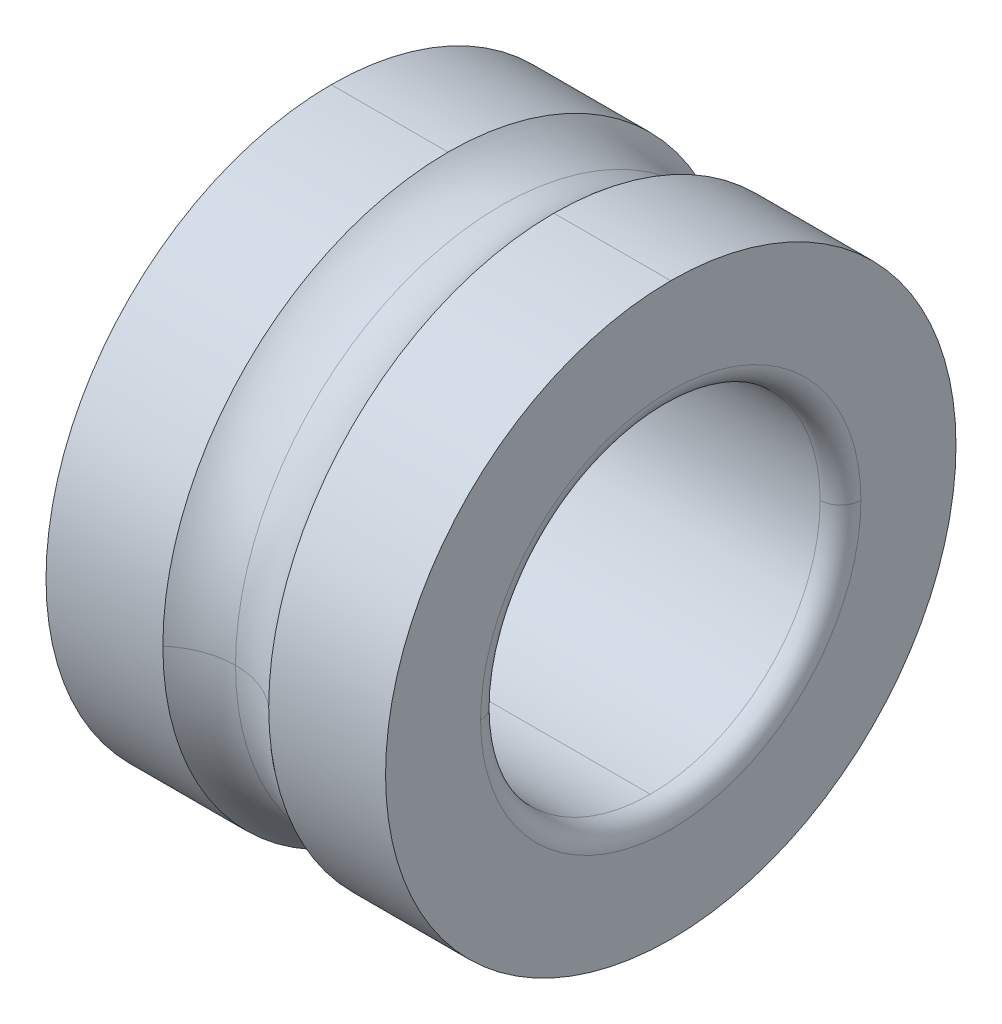
ISO-10303-21;
HEADER;
FILE_DESCRIPTION(('STEP AP214'),'2;1');
FILE_NAME('part.step','',(''),(''),'','','');
FILE_SCHEMA(('AUTOMOTIVE_DESIGN { 1 0 10303 214 1 1 1 1 }'));
ENDSEC;
DATA;
#1=APPLICATION_CONTEXT('core data for automotive mechanical design processes');
#2=APPLICATION_PROTOCOL_DEFINITION('international standard','automotive_design',2000,#1);
#3=PRODUCT_CONTEXT('',#1,'mechanical');
#4=PRODUCT('Part','Part','',(#3));
#5=PRODUCT_RELATED_PRODUCT_CATEGORY('part','',(#4));
#6=PRODUCT_DEFINITION_FORMATION('','',#4);
#7=PRODUCT_DEFINITION_CONTEXT('part definition',#1,'design');
#8=PRODUCT_DEFINITION('design','',#6,#7);
#9=PRODUCT_DEFINITION_SHAPE('','',#8);
#10=(LENGTH_UNIT() NAMED_UNIT(*) SI_UNIT(.MILLI.,.METRE.));
#11=(NAMED_UNIT(*) PLANE_ANGLE_UNIT() SI_UNIT($,.RADIAN.));
#12=(NAMED_UNIT(*) SI_UNIT($,.STERADIAN.) SOLID_ANGLE_UNIT());
#13=UNCERTAINTY_MEASURE_WITH_UNIT(LENGTH_MEASURE(1.E-05),#10,'distance_accuracy_value','');
#14=(GEOMETRIC_REPRESENTATION_CONTEXT(3) GLOBAL_UNCERTAINTY_ASSIGNED_CONTEXT((#13)) GLOBAL_UNIT_ASSIGNED_CONTEXT((#10,
#11,#12)) REPRESENTATION_CONTEXT('',''));
#15=CARTESIAN_POINT('',(0.,0.,0.));
#16=DIRECTION('',(0.,0.,1.));
#17=DIRECTION('',(1.,0.,0.));
#18=AXIS2_PLACEMENT_3D('',#15,#16,#17);
#19=CARTESIAN_POINT('',(4.13964414855096,0.,0.));
#20=DIRECTION('',(1.,0.,0.));
#21=DIRECTION('',(0.,1.,0.));
#22=AXIS2_PLACEMENT_3D('',#19,#20,#21);
#23=CYLINDRICAL_SURFACE('',#22,4.2);
#24=DIRECTION('',(1.,0.,0.));
#25=VECTOR('',#24,1.);
#26=CARTESIAN_POINT('',(4.13964414855096,4.2,0.));
#27=LINE('',#26,#25);
#28=CARTESIAN_POINT('',(3.27928829710191,4.2,0.));
#29=VERTEX_POINT('',#28);
#30=CARTESIAN_POINT('',(5.,4.2,0.));
#31=VERTEX_POINT('',#30);
#32=EDGE_CURVE('E183',#29,#31,#27,.T.);
#33=ORIENTED_EDGE('',*,*,#32,.T.);
#34=CARTESIAN_POINT('',(5.,0.,0.));
#35=DIRECTION('',(1.,0.,0.));
#36=DIRECTION('',(0.,1.,0.));
#37=AXIS2_PLACEMENT_3D('',#34,#35,#36);
#38=CIRCLE('',#37,4.2);
#39=CARTESIAN_POINT('',(5.,-4.2,0.));
#40=VERTEX_POINT('',#39);
#41=EDGE_CURVE('E137',#40,#31,#38,.T.);
#42=ORIENTED_EDGE('',*,*,#41,.F.);
#43=DIRECTION('',(-1.,0.,0.));
#44=VECTOR('',#43,1.);
#45=CARTESIAN_POINT('',(4.13964414855096,-4.2,0.));
#46=LINE('',#45,#44);
#47=CARTESIAN_POINT('',(3.27928829710191,-4.2,0.));
#48=VERTEX_POINT('',#47);
#49=EDGE_CURVE('E191',#40,#48,#46,.T.);
#50=ORIENTED_EDGE('',*,*,#49,.T.);
#51=CARTESIAN_POINT('',(3.27928829710191,0.,0.));
#52=DIRECTION('',(1.,0.,0.));
#53=DIRECTION('',(0.,1.,0.));
#54=AXIS2_PLACEMENT_3D('',#51,#52,#53);
#55=CIRCLE('',#54,4.2);
#56=CARTESIAN_POINT('',(3.27928829710191,0.,-4.2));
#57=VERTEX_POINT('',#56);
#58=EDGE_CURVE('E174',#48,#57,#55,.T.);
#59=ORIENTED_EDGE('',*,*,#58,.T.);
#60=CARTESIAN_POINT('',(3.27928829710191,0.,0.));
#61=DIRECTION('',(1.,0.,0.));
#62=DIRECTION('',(0.,1.,0.));
#63=AXIS2_PLACEMENT_3D('',#60,#61,#62);
#64=CIRCLE('',#63,4.2);
#65=EDGE_CURVE('E180',#57,#29,#64,.T.);
#66=ORIENTED_EDGE('',*,*,#65,.T.);
#67=EDGE_LOOP('',(#33,#42,#50,#59,#66));
#68=FACE_BOUND('',#67,.T.);
#69=ADVANCED_FACE('F16',(#68),#23,.T.);
#70=CARTESIAN_POINT('',(2.5,0.,0.));
#71=DIRECTION('',(1.,0.,0.));
#72=DIRECTION('',(0.,0.,-1.));
#73=AXIS2_PLACEMENT_3D('',#70,#71,#72);
#74=TOROIDAL_SURFACE('',#73,5.1,1.1905);
#75=CARTESIAN_POINT('',(2.5,0.,0.));
#76=DIRECTION('',(-1.,0.,0.));
#77=DIRECTION('',(0.,0.,1.));
#78=AXIS2_PLACEMENT_3D('',#75,#76,#77);
#79=CIRCLE('',#78,3.9095);
#80=CARTESIAN_POINT('',(2.5,0.,3.9095));
#81=VERTEX_POINT('',#80);
#82=CARTESIAN_POINT('',(2.5,0.,-3.9095));
#83=VERTEX_POINT('',#82);
#84=EDGE_CURVE('E167',#81,#83,#79,.T.);
#85=ORIENTED_EDGE('',*,*,#84,.T.);
#86=CARTESIAN_POINT('',(2.5,0.,-5.1));
#87=DIRECTION('',(0.,-1.,0.));
#88=DIRECTION('',(0.,0.,-1.));
#89=AXIS2_PLACEMENT_3D('',#86,#87,#88);
#90=CIRCLE('',#89,1.1905);
#91=CARTESIAN_POINT('',(1.72071170289809,0.,-4.2));
#92=VERTEX_POINT('',#91);
#93=EDGE_CURVE('E160',#83,#92,#90,.T.);
#94=ORIENTED_EDGE('',*,*,#93,.T.);
#95=CARTESIAN_POINT('',(1.72071170289809,0.,0.));
#96=DIRECTION('',(1.,0.,0.));
#97=DIRECTION('',(0.,1.,0.));
#98=AXIS2_PLACEMENT_3D('',#95,#96,#97);
#99=CIRCLE('',#98,4.2);
#100=CARTESIAN_POINT('',(1.72071170289809,4.2,0.));
#101=VERTEX_POINT('',#100);
#102=EDGE_CURVE('E11',#92,#101,#99,.T.);
#103=ORIENTED_EDGE('',*,*,#102,.T.);
#104=CARTESIAN_POINT('',(1.72071170289809,0.,0.));
#105=DIRECTION('',(1.,0.,0.));
#106=DIRECTION('',(0.,1.,0.));
#107=AXIS2_PLACEMENT_3D('',#104,#105,#106);
#108=CIRCLE('',#107,4.2);
#109=CARTESIAN_POINT('',(1.72071170289809,0.,4.2));
#110=VERTEX_POINT('',#109);
#111=EDGE_CURVE('E159',#101,#110,#108,.T.);
#112=ORIENTED_EDGE('',*,*,#111,.T.);
#113=CARTESIAN_POINT('',(2.5,0.,5.1));
#114=DIRECTION('',(0.,-1.,0.));
#115=DIRECTION('',(0.,0.,1.));
#116=AXIS2_PLACEMENT_3D('',#113,#114,#115);
#117=CIRCLE('',#116,1.1905);
#118=EDGE_CURVE('E201',#110,#81,#117,.T.);
#119=ORIENTED_EDGE('',*,*,#118,.T.);
#120=EDGE_LOOP('',(#85,#94,#103,#112,#119));
#121=FACE_BOUND('',#120,.T.);
#122=ADVANCED_FACE('F259',(#121),#74,.F.);
#123=CARTESIAN_POINT('',(0.860355851449043,0.,0.));
#124=DIRECTION('',(1.,0.,0.));
#125=DIRECTION('',(0.,1.,0.));
#126=AXIS2_PLACEMENT_3D('',#123,#124,#125);
#127=CYLINDRICAL_SURFACE('',#126,4.2);
#128=DIRECTION('',(1.,0.,0.));
#129=VECTOR('',#128,1.);
#130=CARTESIAN_POINT('',(0.860355851449043,4.2,0.));
#131=LINE('',#130,#129);
#132=CARTESIAN_POINT('',(0.,4.2,0.));
#133=VERTEX_POINT('',#132);
#134=EDGE_CURVE('E148',#133,#101,#131,.T.);
#135=ORIENTED_EDGE('',*,*,#134,.T.);
#136=ORIENTED_EDGE('',*,*,#102,.F.);
#137=CARTESIAN_POINT('',(1.72071170289809,0.,0.));
#138=DIRECTION('',(1.,0.,0.));
#139=DIRECTION('',(0.,1.,0.));
#140=AXIS2_PLACEMENT_3D('',#137,#138,#139);
#141=CIRCLE('',#140,4.2);
#142=CARTESIAN_POINT('',(1.72071170289809,-4.2,0.));
#143=VERTEX_POINT('',#142);
#144=EDGE_CURVE('E163',#143,#92,#141,.T.);
#145=ORIENTED_EDGE('',*,*,#144,.F.);
#146=DIRECTION('',(-1.,0.,0.));
#147=VECTOR('',#146,1.);
#148=CARTESIAN_POINT('',(0.860355851449043,-4.2,0.));
#149=LINE('',#148,#147);
#150=CARTESIAN_POINT('',(0.,-4.2,0.));
#151=VERTEX_POINT('',#150);
#152=EDGE_CURVE('E150',#143,#151,#149,.T.);
#153=ORIENTED_EDGE('',*,*,#152,.T.);
#154=CARTESIAN_POINT('',(0.,0.,0.));
#155=DIRECTION('',(1.,0.,0.));
#156=DIRECTION('',(0.,1.,0.));
#157=AXIS2_PLACEMENT_3D('',#154,#155,#156);
#158=CIRCLE('',#157,4.2);
#159=EDGE_CURVE('E24',#151,#133,#158,.T.);
#160=ORIENTED_EDGE('',*,*,#159,.T.);
#161=EDGE_LOOP('',(#135,#136,#145,#153,#160));
#162=FACE_BOUND('',#161,.T.);
#163=ADVANCED_FACE('F146',(#162),#127,.T.);
#164=CARTESIAN_POINT('',(0.,3.5,0.));
#165=DIRECTION('',(-1.,0.,0.));
#166=DIRECTION('',(0.,0.,1.));
#167=AXIS2_PLACEMENT_3D('',#164,#165,#166);
#168=PLANE('',#167);
#169=CARTESIAN_POINT('',(0.,0.,0.));
#170=DIRECTION('',(1.,0.,0.));
#171=DIRECTION('',(0.,1.,0.));
#172=AXIS2_PLACEMENT_3D('',#169,#170,#171);
#173=CIRCLE('',#172,2.8);
#174=CARTESIAN_POINT('',(0.,0.,2.8));
#175=VERTEX_POINT('',#174);
#176=CARTESIAN_POINT('',(0.,0.,-2.8));
#177=VERTEX_POINT('',#176);
#178=EDGE_CURVE('E140',#175,#177,#173,.T.);
#179=ORIENTED_EDGE('',*,*,#178,.T.);
#180=CARTESIAN_POINT('',(0.,0.,0.));
#181=DIRECTION('',(1.,0.,0.));
#182=DIRECTION('',(0.,1.,0.));
#183=AXIS2_PLACEMENT_3D('',#180,#181,#182);
#184=CIRCLE('',#183,2.8);
#185=EDGE_CURVE('E222',#177,#175,#184,.T.);
#186=ORIENTED_EDGE('',*,*,#185,.T.);
#187=EDGE_LOOP('',(#179,#186));
#188=FACE_BOUND('',#187,.T.);
#189=CARTESIAN_POINT('',(0.,0.,0.));
#190=DIRECTION('',(1.,0.,0.));
#191=DIRECTION('',(0.,1.,0.));
#192=AXIS2_PLACEMENT_3D('',#189,#190,#191);
#193=CIRCLE('',#192,4.2);
#194=EDGE_CURVE('E153',#133,#151,#193,.T.);
#195=ORIENTED_EDGE('',*,*,#194,.F.);
#196=ORIENTED_EDGE('',*,*,#159,.F.);
#197=EDGE_LOOP('',(#195,#196));
#198=FACE_BOUND('',#197,.T.);
#199=ADVANCED_FACE('F18',(#188,#198),#168,.T.);
#200=CARTESIAN_POINT('',(0.3,0.,0.));
#201=DIRECTION('',(1.,0.,0.));
#202=DIRECTION('',(0.,0.,-1.));
#203=AXIS2_PLACEMENT_3D('',#200,#201,#202);
#204=TOROIDAL_SURFACE('',#203,2.8,0.3);
#205=CARTESIAN_POINT('',(0.3,0.,-2.8));
#206=DIRECTION('',(0.,-1.,0.));
#207=DIRECTION('',(0.,0.,-1.));
#208=AXIS2_PLACEMENT_3D('',#205,#206,#207);
#209=CIRCLE('',#208,0.3);
#210=CARTESIAN_POINT('',(0.3,0.,-2.5));
#211=VERTEX_POINT('',#210);
#212=EDGE_CURVE('E210',#211,#177,#209,.T.);
#213=ORIENTED_EDGE('',*,*,#212,.T.);
#214=ORIENTED_EDGE('',*,*,#178,.F.);
#215=CARTESIAN_POINT('',(0.3,0.,2.8));
#216=DIRECTION('',(0.,-1.,0.));
#217=DIRECTION('',(0.,0.,1.));
#218=AXIS2_PLACEMENT_3D('',#215,#216,#217);
#219=CIRCLE('',#218,0.3);
#220=CARTESIAN_POINT('',(0.3,0.,2.5));
#221=VERTEX_POINT('',#220);
#222=EDGE_CURVE('E219',#175,#221,#219,.T.);
#223=ORIENTED_EDGE('',*,*,#222,.T.);
#224=CARTESIAN_POINT('',(0.3,0.,0.));
#225=DIRECTION('',(1.,0.,0.));
#226=DIRECTION('',(0.,1.,0.));
#227=AXIS2_PLACEMENT_3D('',#224,#225,#226);
#228=CIRCLE('',#227,2.5);
#229=CARTESIAN_POINT('',(0.3,-2.5,0.));
#230=VERTEX_POINT('',#229);
#231=EDGE_CURVE('E138',#221,#230,#228,.T.);
#232=ORIENTED_EDGE('',*,*,#231,.T.);
#233=CARTESIAN_POINT('',(0.3,0.,0.));
#234=DIRECTION('',(1.,0.,0.));
#235=DIRECTION('',(0.,1.,0.));
#236=AXIS2_PLACEMENT_3D('',#233,#234,#235);
#237=CIRCLE('',#236,2.5);
#238=EDGE_CURVE('E130',#230,#211,#237,.T.);
#239=ORIENTED_EDGE('',*,*,#238,.T.);
#240=EDGE_LOOP('',(#213,#214,#223,#232,#239));
#241=FACE_BOUND('',#240,.T.);
#242=ADVANCED_FACE('F228',(#241),#204,.T.);
#243=CARTESIAN_POINT('',(2.5,0.,0.));
#244=DIRECTION('',(1.,0.,0.));
#245=DIRECTION('',(0.,1.,0.));
#246=AXIS2_PLACEMENT_3D('',#243,#244,#245);
#247=CYLINDRICAL_SURFACE('',#246,2.5);
#248=DIRECTION('',(1.,0.,0.));
#249=VECTOR('',#248,1.);
#250=CARTESIAN_POINT('',(2.5,2.5,0.));
#251=LINE('',#250,#249);
#252=CARTESIAN_POINT('',(0.3,2.5,0.));
#253=VERTEX_POINT('',#252);
#254=CARTESIAN_POINT('',(4.7,2.5,0.));
#255=VERTEX_POINT('',#254);
#256=EDGE_CURVE('E225',#253,#255,#251,.T.);
#257=ORIENTED_EDGE('',*,*,#256,.T.);
#258=CARTESIAN_POINT('',(4.7,0.,0.));
#259=DIRECTION('',(1.,0.,0.));
#260=DIRECTION('',(0.,1.,0.));
#261=AXIS2_PLACEMENT_3D('',#258,#259,#260);
#262=CIRCLE('',#261,2.5);
#263=CARTESIAN_POINT('',(4.7,0.,2.5));
#264=VERTEX_POINT('',#263);
#265=EDGE_CURVE('E121',#255,#264,#262,.T.);
#266=ORIENTED_EDGE('',*,*,#265,.T.);
#267=CARTESIAN_POINT('',(4.7,0.,0.));
#268=DIRECTION('',(1.,0.,0.));
#269=DIRECTION('',(0.,1.,0.));
#270=AXIS2_PLACEMENT_3D('',#267,#268,#269);
#271=CIRCLE('',#270,2.5);
#272=CARTESIAN_POINT('',(4.7,-2.5,0.));
#273=VERTEX_POINT('',#272);
#274=EDGE_CURVE('E31',#264,#273,#271,.T.);
#275=ORIENTED_EDGE('',*,*,#274,.T.);
#276=DIRECTION('',(-1.,0.,0.));
#277=VECTOR('',#276,1.);
#278=CARTESIAN_POINT('',(2.5,-2.5,0.));
#279=LINE('',#278,#277);
#280=EDGE_CURVE('E128',#273,#230,#279,.T.);
#281=ORIENTED_EDGE('',*,*,#280,.T.);
#282=ORIENTED_EDGE('',*,*,#231,.F.);
#283=CARTESIAN_POINT('',(0.3,0.,0.));
#284=DIRECTION('',(1.,0.,0.));
#285=DIRECTION('',(0.,1.,0.));
#286=AXIS2_PLACEMENT_3D('',#283,#284,#285);
#287=CIRCLE('',#286,2.5);
#288=EDGE_CURVE('E216',#253,#221,#287,.T.);
#289=ORIENTED_EDGE('',*,*,#288,.F.);
#290=EDGE_LOOP('',(#257,#266,#275,#281,#282,#289));
#291=FACE_BOUND('',#290,.T.);
#292=ADVANCED_FACE('F237',(#291),#247,.F.);
#293=CARTESIAN_POINT('',(4.7,0.,0.));
#294=DIRECTION('',(1.,0.,0.));
#295=DIRECTION('',(0.,0.,-1.));
#296=AXIS2_PLACEMENT_3D('',#293,#294,#295);
#297=TOROIDAL_SURFACE('',#296,2.8,0.3);
#298=CARTESIAN_POINT('',(4.7,0.,-2.8));
#299=DIRECTION('',(0.,-1.,0.));
#300=DIRECTION('',(0.,0.,-1.));
#301=AXIS2_PLACEMENT_3D('',#298,#299,#300);
#302=CIRCLE('',#301,0.3);
#303=CARTESIAN_POINT('',(5.,0.,-2.8));
#304=VERTEX_POINT('',#303);
#305=CARTESIAN_POINT('',(4.7,0.,-2.5));
#306=VERTEX_POINT('',#305);
#307=EDGE_CURVE('E107',#304,#306,#302,.T.);
#308=ORIENTED_EDGE('',*,*,#307,.T.);
#309=CARTESIAN_POINT('',(4.7,0.,0.));
#310=DIRECTION('',(1.,0.,0.));
#311=DIRECTION('',(0.,1.,0.));
#312=AXIS2_PLACEMENT_3D('',#309,#310,#311);
#313=CIRCLE('',#312,2.5);
#314=EDGE_CURVE('E111',#273,#306,#313,.T.);
#315=ORIENTED_EDGE('',*,*,#314,.F.);
#316=ORIENTED_EDGE('',*,*,#274,.F.);
#317=CARTESIAN_POINT('',(4.7,0.,2.8));
#318=DIRECTION('',(0.,-1.,0.));
#319=DIRECTION('',(0.,0.,1.));
#320=AXIS2_PLACEMENT_3D('',#317,#318,#319);
#321=CIRCLE('',#320,0.3);
#322=CARTESIAN_POINT('',(5.,0.,2.8));
#323=VERTEX_POINT('',#322);
#324=EDGE_CURVE('E134',#264,#323,#321,.T.);
#325=ORIENTED_EDGE('',*,*,#324,.T.);
#326=CARTESIAN_POINT('',(5.,0.,0.));
#327=DIRECTION('',(1.,0.,0.));
#328=DIRECTION('',(0.,1.,0.));
#329=AXIS2_PLACEMENT_3D('',#326,#327,#328);
#330=CIRCLE('',#329,2.8);
#331=EDGE_CURVE('E39',#323,#304,#330,.T.);
#332=ORIENTED_EDGE('',*,*,#331,.T.);
#333=EDGE_LOOP('',(#308,#315,#316,#325,#332));
#334=FACE_BOUND('',#333,.T.);
#335=ADVANCED_FACE('F109',(#334),#297,.T.);
#336=CARTESIAN_POINT('',(5.,3.5,0.));
#337=DIRECTION('',(1.,0.,0.));
#338=DIRECTION('',(0.,1.,0.));
#339=AXIS2_PLACEMENT_3D('',#336,#337,#338);
#340=PLANE('',#339);
#341=CARTESIAN_POINT('',(5.,0.,0.));
#342=DIRECTION('',(1.,0.,0.));
#343=DIRECTION('',(0.,1.,0.));
#344=AXIS2_PLACEMENT_3D('',#341,#342,#343);
#345=CIRCLE('',#344,2.8);
#346=EDGE_CURVE('E115',#304,#323,#345,.T.);
#347=ORIENTED_EDGE('',*,*,#346,.F.);
#348=ORIENTED_EDGE('',*,*,#331,.F.);
#349=EDGE_LOOP('',(#347,#348));
#350=FACE_BOUND('',#349,.T.);
#351=CARTESIAN_POINT('',(5.,0.,0.));
#352=DIRECTION('',(1.,0.,0.));
#353=DIRECTION('',(0.,1.,0.));
#354=AXIS2_PLACEMENT_3D('',#351,#352,#353);
#355=CIRCLE('',#354,4.2);
#356=EDGE_CURVE('E193',#31,#40,#355,.T.);
#357=ORIENTED_EDGE('',*,*,#356,.T.);
#358=ORIENTED_EDGE('',*,*,#41,.T.);
#359=EDGE_LOOP('',(#357,#358));
#360=FACE_BOUND('',#359,.T.);
#361=ADVANCED_FACE('F238',(#350,#360),#340,.T.);
#362=CARTESIAN_POINT('',(4.7,0.,0.));
#363=DIRECTION('',(1.,0.,0.));
#364=DIRECTION('',(0.,0.,-1.));
#365=AXIS2_PLACEMENT_3D('',#362,#363,#364);
#366=TOROIDAL_SURFACE('',#365,2.8,0.3);
#367=ORIENTED_EDGE('',*,*,#307,.F.);
#368=ORIENTED_EDGE('',*,*,#346,.T.);
#369=ORIENTED_EDGE('',*,*,#324,.F.);
#370=ORIENTED_EDGE('',*,*,#265,.F.);
#371=CARTESIAN_POINT('',(4.7,0.,0.));
#372=DIRECTION('',(1.,0.,0.));
#373=DIRECTION('',(0.,1.,0.));
#374=AXIS2_PLACEMENT_3D('',#371,#372,#373);
#375=CIRCLE('',#374,2.5);
#376=EDGE_CURVE('E116',#306,#255,#375,.T.);
#377=ORIENTED_EDGE('',*,*,#376,.F.);
#378=EDGE_LOOP('',(#367,#368,#369,#370,#377));
#379=FACE_BOUND('',#378,.T.);
#380=ADVANCED_FACE('F119',(#379),#366,.T.);
#381=CARTESIAN_POINT('',(2.5,0.,0.));
#382=DIRECTION('',(1.,0.,0.));
#383=DIRECTION('',(0.,1.,0.));
#384=AXIS2_PLACEMENT_3D('',#381,#382,#383);
#385=CYLINDRICAL_SURFACE('',#384,2.5);
#386=ORIENTED_EDGE('',*,*,#256,.F.);
#387=CARTESIAN_POINT('',(0.3,0.,0.));
#388=DIRECTION('',(1.,0.,0.));
#389=DIRECTION('',(0.,1.,0.));
#390=AXIS2_PLACEMENT_3D('',#387,#388,#389);
#391=CIRCLE('',#390,2.5);
#392=EDGE_CURVE('E213',#211,#253,#391,.T.);
#393=ORIENTED_EDGE('',*,*,#392,.F.);
#394=ORIENTED_EDGE('',*,*,#238,.F.);
#395=ORIENTED_EDGE('',*,*,#280,.F.);
#396=ORIENTED_EDGE('',*,*,#314,.T.);
#397=ORIENTED_EDGE('',*,*,#376,.T.);
#398=EDGE_LOOP('',(#386,#393,#394,#395,#396,#397));
#399=FACE_BOUND('',#398,.T.);
#400=ADVANCED_FACE('F125',(#399),#385,.F.);
#401=CARTESIAN_POINT('',(0.3,0.,0.));
#402=DIRECTION('',(1.,0.,0.));
#403=DIRECTION('',(0.,0.,-1.));
#404=AXIS2_PLACEMENT_3D('',#401,#402,#403);
#405=TOROIDAL_SURFACE('',#404,2.8,0.3);
#406=ORIENTED_EDGE('',*,*,#212,.F.);
#407=ORIENTED_EDGE('',*,*,#392,.T.);
#408=ORIENTED_EDGE('',*,*,#288,.T.);
#409=ORIENTED_EDGE('',*,*,#222,.F.);
#410=ORIENTED_EDGE('',*,*,#185,.F.);
#411=EDGE_LOOP('',(#406,#407,#408,#409,#410));
#412=FACE_BOUND('',#411,.T.);
#413=ADVANCED_FACE('F233',(#412),#405,.T.);
#414=CARTESIAN_POINT('',(0.860355851449043,0.,0.));
#415=DIRECTION('',(1.,0.,0.));
#416=DIRECTION('',(0.,1.,0.));
#417=AXIS2_PLACEMENT_3D('',#414,#415,#416);
#418=CYLINDRICAL_SURFACE('',#417,4.2);
#419=ORIENTED_EDGE('',*,*,#134,.F.);
#420=ORIENTED_EDGE('',*,*,#194,.T.);
#421=ORIENTED_EDGE('',*,*,#152,.F.);
#422=CARTESIAN_POINT('',(1.72071170289809,0.,0.));
#423=DIRECTION('',(1.,0.,0.));
#424=DIRECTION('',(0.,1.,0.));
#425=AXIS2_PLACEMENT_3D('',#422,#423,#424);
#426=CIRCLE('',#425,4.2);
#427=EDGE_CURVE('E203',#110,#143,#426,.T.);
#428=ORIENTED_EDGE('',*,*,#427,.F.);
#429=ORIENTED_EDGE('',*,*,#111,.F.);
#430=EDGE_LOOP('',(#419,#420,#421,#428,#429));
#431=FACE_BOUND('',#430,.T.);
#432=ADVANCED_FACE('F157',(#431),#418,.T.);
#433=CARTESIAN_POINT('',(2.5,0.,0.));
#434=DIRECTION('',(1.,0.,0.));
#435=DIRECTION('',(0.,0.,-1.));
#436=AXIS2_PLACEMENT_3D('',#433,#434,#435);
#437=TOROIDAL_SURFACE('',#436,5.1,1.1905);
#438=CARTESIAN_POINT('',(2.5,0.,0.));
#439=DIRECTION('',(-1.,0.,0.));
#440=DIRECTION('',(0.,0.,1.));
#441=AXIS2_PLACEMENT_3D('',#438,#439,#440);
#442=CIRCLE('',#441,3.9095);
#443=EDGE_CURVE('E177',#83,#81,#442,.T.);
#444=ORIENTED_EDGE('',*,*,#443,.T.);
#445=ORIENTED_EDGE('',*,*,#118,.F.);
#446=ORIENTED_EDGE('',*,*,#427,.T.);
#447=ORIENTED_EDGE('',*,*,#144,.T.);
#448=ORIENTED_EDGE('',*,*,#93,.F.);
#449=EDGE_LOOP('',(#444,#445,#446,#447,#448));
#450=FACE_BOUND('',#449,.T.);
#451=ADVANCED_FACE('F262',(#450),#437,.F.);
#452=CARTESIAN_POINT('',(4.13964414855096,0.,0.));
#453=DIRECTION('',(1.,0.,0.));
#454=DIRECTION('',(0.,1.,0.));
#455=AXIS2_PLACEMENT_3D('',#452,#453,#454);
#456=CYLINDRICAL_SURFACE('',#455,4.2);
#457=ORIENTED_EDGE('',*,*,#32,.F.);
#458=CARTESIAN_POINT('',(3.27928829710191,0.,0.));
#459=DIRECTION('',(1.,0.,0.));
#460=DIRECTION('',(0.,1.,0.));
#461=AXIS2_PLACEMENT_3D('',#458,#459,#460);
#462=CIRCLE('',#461,4.2);
#463=CARTESIAN_POINT('',(3.27928829710191,0.,4.2));
#464=VERTEX_POINT('',#463);
#465=EDGE_CURVE('E173',#29,#464,#462,.T.);
#466=ORIENTED_EDGE('',*,*,#465,.T.);
#467=CARTESIAN_POINT('',(3.27928829710191,0.,0.));
#468=DIRECTION('',(1.,0.,0.));
#469=DIRECTION('',(0.,1.,0.));
#470=AXIS2_PLACEMENT_3D('',#467,#468,#469);
#471=CIRCLE('',#470,4.2);
#472=EDGE_CURVE('E176',#464,#48,#471,.T.);
#473=ORIENTED_EDGE('',*,*,#472,.T.);
#474=ORIENTED_EDGE('',*,*,#49,.F.);
#475=ORIENTED_EDGE('',*,*,#356,.F.);
#476=EDGE_LOOP('',(#457,#466,#473,#474,#475));
#477=FACE_BOUND('',#476,.T.);
#478=ADVANCED_FACE('F245',(#477),#456,.T.);
#479=CARTESIAN_POINT('',(2.5,0.,0.));
#480=DIRECTION('',(1.,0.,0.));
#481=DIRECTION('',(0.,0.,-1.));
#482=AXIS2_PLACEMENT_3D('',#479,#480,#481);
#483=TOROIDAL_SURFACE('',#482,5.1,1.1905);
#484=ORIENTED_EDGE('',*,*,#443,.F.);
#485=CARTESIAN_POINT('',(2.5,0.,-5.1));
#486=DIRECTION('',(0.,-1.,0.));
#487=DIRECTION('',(0.,0.,-1.));
#488=AXIS2_PLACEMENT_3D('',#485,#486,#487);
#489=CIRCLE('',#488,1.1905);
#490=EDGE_CURVE('E187',#57,#83,#489,.T.);
#491=ORIENTED_EDGE('',*,*,#490,.F.);
#492=ORIENTED_EDGE('',*,*,#58,.F.);
#493=ORIENTED_EDGE('',*,*,#472,.F.);
#494=CARTESIAN_POINT('',(2.5,0.,5.1));
#495=DIRECTION('',(0.,-1.,0.));
#496=DIRECTION('',(0.,0.,1.));
#497=AXIS2_PLACEMENT_3D('',#494,#495,#496);
#498=CIRCLE('',#497,1.1905);
#499=EDGE_CURVE('E170',#81,#464,#498,.T.);
#500=ORIENTED_EDGE('',*,*,#499,.F.);
#501=EDGE_LOOP('',(#484,#491,#492,#493,#500));
#502=FACE_BOUND('',#501,.T.);
#503=ADVANCED_FACE('F257',(#502),#483,.F.);
#504=CARTESIAN_POINT('',(2.5,0.,0.));
#505=DIRECTION('',(1.,0.,0.));
#506=DIRECTION('',(0.,0.,-1.));
#507=AXIS2_PLACEMENT_3D('',#504,#505,#506);
#508=TOROIDAL_SURFACE('',#507,5.1,1.1905);
#509=ORIENTED_EDGE('',*,*,#84,.F.);
#510=ORIENTED_EDGE('',*,*,#499,.T.);
#511=ORIENTED_EDGE('',*,*,#465,.F.);
#512=ORIENTED_EDGE('',*,*,#65,.F.);
#513=ORIENTED_EDGE('',*,*,#490,.T.);
#514=EDGE_LOOP('',(#509,#510,#511,#512,#513));
#515=FACE_BOUND('',#514,.T.);
#516=ADVANCED_FACE('F254',(#515),#508,.F.);
#517=CLOSED_SHELL('',(#69,#122,#163,#199,#242,#292,#335,#361,#380,#400,#413,#432,#451,#478,#503,#516));
#518=MANIFOLD_SOLID_BREP('B1',#517);
#519=ADVANCED_BREP_SHAPE_REPRESENTATION('',(#18,#518),#14);
#520=SHAPE_DEFINITION_REPRESENTATION(#9,#519);
ENDSEC;
END-ISO-10303-21;
